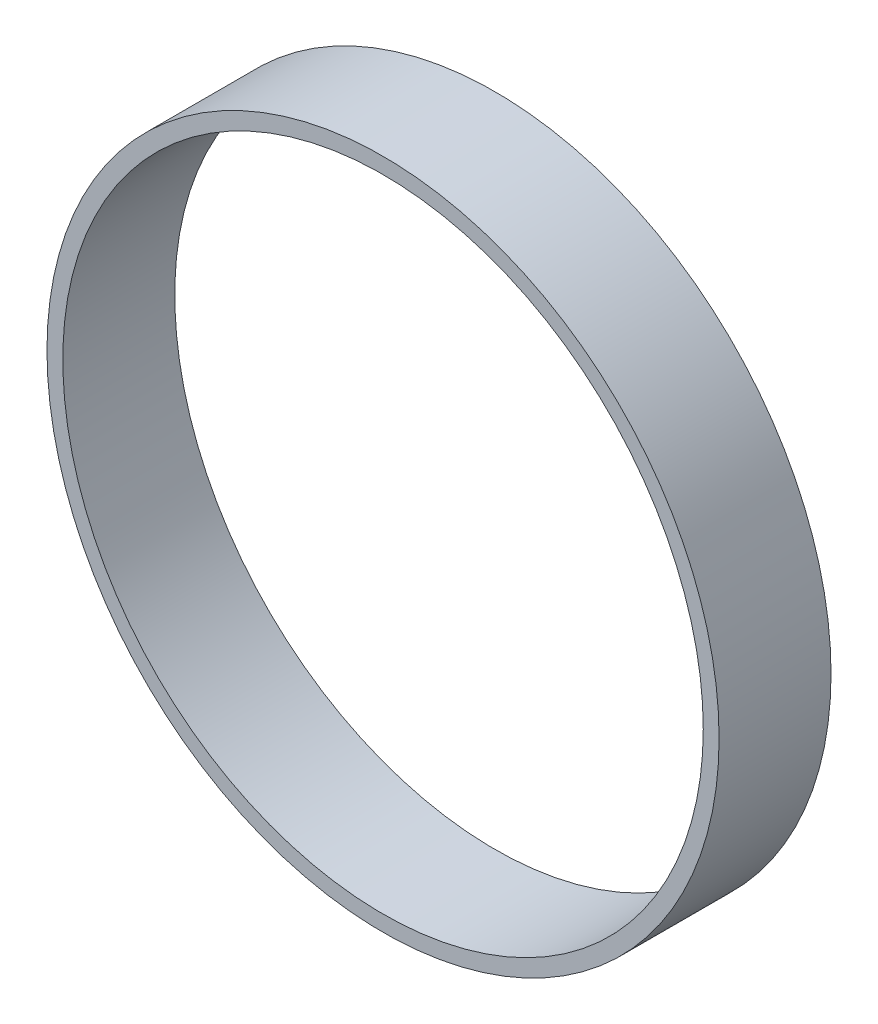
ISO-10303-21;
HEADER;
FILE_DESCRIPTION(('STEP AP214'),'2;1');
FILE_NAME('part.step','',(''),(''),'','','');
FILE_SCHEMA(('AUTOMOTIVE_DESIGN { 1 0 10303 214 1 1 1 1 }'));
ENDSEC;
DATA;
#1=APPLICATION_CONTEXT('core data for automotive mechanical design processes');
#2=APPLICATION_PROTOCOL_DEFINITION('international standard','automotive_design',2000,#1);
#3=PRODUCT_CONTEXT('',#1,'mechanical');
#4=PRODUCT('Part','Part','',(#3));
#5=PRODUCT_RELATED_PRODUCT_CATEGORY('part','',(#4));
#6=PRODUCT_DEFINITION_FORMATION('','',#4);
#7=PRODUCT_DEFINITION_CONTEXT('part definition',#1,'design');
#8=PRODUCT_DEFINITION('design','',#6,#7);
#9=PRODUCT_DEFINITION_SHAPE('','',#8);
#10=(LENGTH_UNIT() NAMED_UNIT(*) SI_UNIT(.MILLI.,.METRE.));
#11=(NAMED_UNIT(*) PLANE_ANGLE_UNIT() SI_UNIT($,.RADIAN.));
#12=(NAMED_UNIT(*) SI_UNIT($,.STERADIAN.) SOLID_ANGLE_UNIT());
#13=UNCERTAINTY_MEASURE_WITH_UNIT(LENGTH_MEASURE(1.E-05),#10,'distance_accuracy_value','');
#14=(GEOMETRIC_REPRESENTATION_CONTEXT(3) GLOBAL_UNCERTAINTY_ASSIGNED_CONTEXT((#13)) GLOBAL_UNIT_ASSIGNED_CONTEXT((#10,
#11,#12)) REPRESENTATION_CONTEXT('',''));
#15=CARTESIAN_POINT('',(0.,0.,0.));
#16=DIRECTION('',(0.,0.,1.));
#17=DIRECTION('',(1.,0.,0.));
#18=AXIS2_PLACEMENT_3D('',#15,#16,#17);
#19=CARTESIAN_POINT('',(0.,0.,5.207));
#20=DIRECTION('',(0.,0.,1.));
#21=DIRECTION('',(1.,0.,0.));
#22=AXIS2_PLACEMENT_3D('',#19,#20,#21);
#23=PLANE('',#22);
#24=CARTESIAN_POINT('',(0.,0.,5.207));
#25=DIRECTION('',(0.,0.,1.));
#26=DIRECTION('',(1.,0.,0.));
#27=AXIS2_PLACEMENT_3D('',#24,#25,#26);
#28=CIRCLE('',#27,15.6337);
#29=CARTESIAN_POINT('',(15.6337,0.,5.207));
#30=VERTEX_POINT('',#29);
#31=EDGE_CURVE('E10',#30,#30,#28,.T.);
#32=ORIENTED_EDGE('',*,*,#31,.T.);
#33=EDGE_LOOP('',(#32));
#34=FACE_BOUND('',#33,.T.);
#35=CARTESIAN_POINT('',(0.,0.,5.207));
#36=DIRECTION('',(0.,0.,1.));
#37=DIRECTION('',(1.,0.,0.));
#38=AXIS2_PLACEMENT_3D('',#35,#36,#37);
#39=CIRCLE('',#38,14.8971);
#40=CARTESIAN_POINT('',(14.8971,0.,5.207));
#41=VERTEX_POINT('',#40);
#42=EDGE_CURVE('E48',#41,#41,#39,.T.);
#43=ORIENTED_EDGE('',*,*,#42,.F.);
#44=EDGE_LOOP('',(#43));
#45=FACE_BOUND('',#44,.T.);
#46=ADVANCED_FACE('F37',(#34,#45),#23,.T.);
#47=CARTESIAN_POINT('',(0.,0.,0.));
#48=DIRECTION('',(0.,0.,1.));
#49=DIRECTION('',(1.,0.,0.));
#50=AXIS2_PLACEMENT_3D('',#47,#48,#49);
#51=PLANE('',#50);
#52=CARTESIAN_POINT('',(0.,0.,0.));
#53=DIRECTION('',(0.,0.,1.));
#54=DIRECTION('',(1.,0.,0.));
#55=AXIS2_PLACEMENT_3D('',#52,#53,#54);
#56=CIRCLE('',#55,15.6337);
#57=CARTESIAN_POINT('',(15.6337,0.,0.));
#58=VERTEX_POINT('',#57);
#59=EDGE_CURVE('E44',#58,#58,#56,.T.);
#60=ORIENTED_EDGE('',*,*,#59,.F.);
#61=EDGE_LOOP('',(#60));
#62=FACE_BOUND('',#61,.T.);
#63=CARTESIAN_POINT('',(0.,0.,0.));
#64=DIRECTION('',(0.,0.,1.));
#65=DIRECTION('',(1.,0.,0.));
#66=AXIS2_PLACEMENT_3D('',#63,#64,#65);
#67=CIRCLE('',#66,14.8971);
#68=CARTESIAN_POINT('',(14.8971,0.,0.));
#69=VERTEX_POINT('',#68);
#70=EDGE_CURVE('E52',#69,#69,#67,.T.);
#71=ORIENTED_EDGE('',*,*,#70,.T.);
#72=EDGE_LOOP('',(#71));
#73=FACE_BOUND('',#72,.T.);
#74=ADVANCED_FACE('F58',(#62,#73),#51,.F.);
#75=CARTESIAN_POINT('',(0.,0.,5.207));
#76=DIRECTION('',(0.,0.,-1.));
#77=DIRECTION('',(-1.,0.,0.));
#78=AXIS2_PLACEMENT_3D('',#75,#76,#77);
#79=CYLINDRICAL_SURFACE('',#78,15.6337);
#80=ORIENTED_EDGE('',*,*,#31,.F.);
#81=EDGE_LOOP('',(#80));
#82=FACE_BOUND('',#81,.T.);
#83=ORIENTED_EDGE('',*,*,#59,.T.);
#84=EDGE_LOOP('',(#83));
#85=FACE_BOUND('',#84,.T.);
#86=ADVANCED_FACE('F39',(#82,#85),#79,.T.);
#87=CARTESIAN_POINT('',(0.,0.,5.207));
#88=DIRECTION('',(0.,0.,-1.));
#89=DIRECTION('',(-1.,0.,0.));
#90=AXIS2_PLACEMENT_3D('',#87,#88,#89);
#91=CYLINDRICAL_SURFACE('',#90,14.8971);
#92=ORIENTED_EDGE('',*,*,#42,.T.);
#93=EDGE_LOOP('',(#92));
#94=FACE_BOUND('',#93,.T.);
#95=ORIENTED_EDGE('',*,*,#70,.F.);
#96=EDGE_LOOP('',(#95));
#97=FACE_BOUND('',#96,.T.);
#98=ADVANCED_FACE('F60',(#94,#97),#91,.F.);
#99=CLOSED_SHELL('',(#46,#74,#86,#98));
#100=MANIFOLD_SOLID_BREP('B2',#99);
#101=ADVANCED_BREP_SHAPE_REPRESENTATION('',(#18,#100),#14);
#102=SHAPE_DEFINITION_REPRESENTATION(#9,#101);
ENDSEC;
END-ISO-10303-21;
